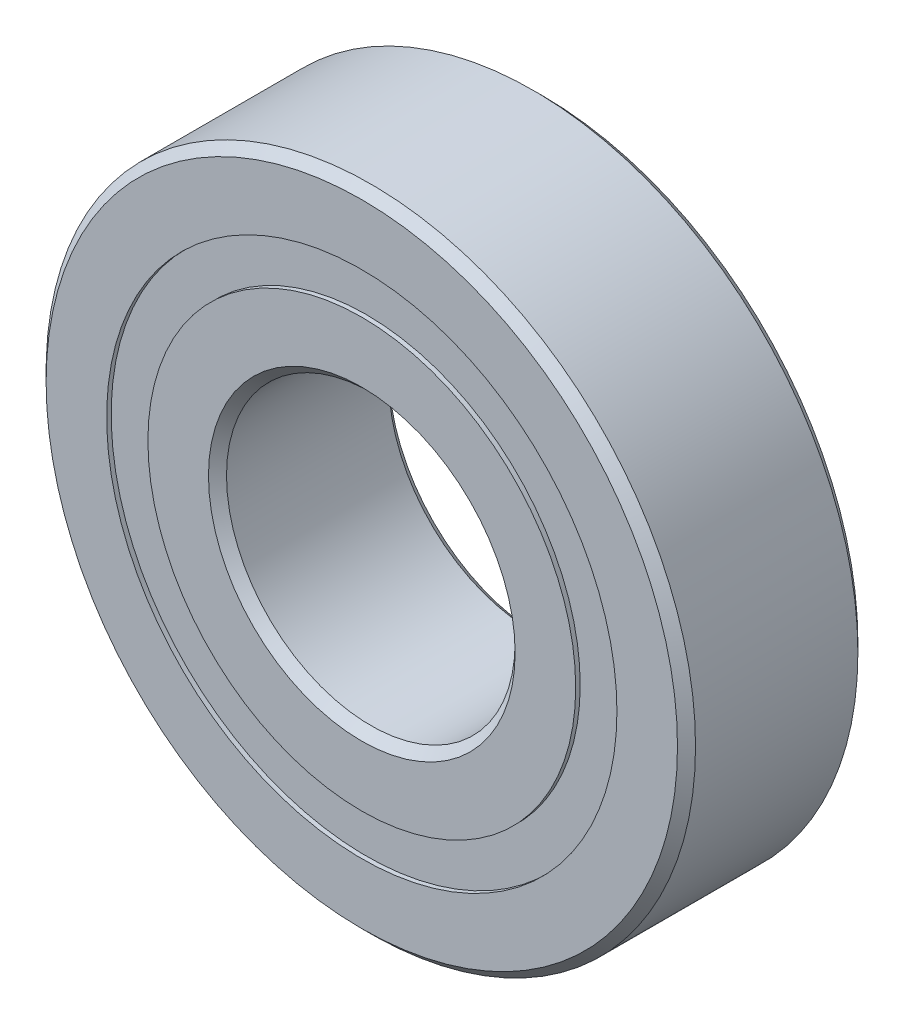
ISO-10303-21;
HEADER;
FILE_DESCRIPTION(('STEP AP214'),'2;1');
FILE_NAME('part.step','',(''),(''),'','','');
FILE_SCHEMA(('AUTOMOTIVE_DESIGN { 1 0 10303 214 1 1 1 1 }'));
ENDSEC;
DATA;
#1=APPLICATION_CONTEXT('core data for automotive mechanical design processes');
#2=APPLICATION_PROTOCOL_DEFINITION('international standard','automotive_design',2000,#1);
#3=PRODUCT_CONTEXT('',#1,'mechanical');
#4=PRODUCT('Part','Part','',(#3));
#5=PRODUCT_RELATED_PRODUCT_CATEGORY('part','',(#4));
#6=PRODUCT_DEFINITION_FORMATION('','',#4);
#7=PRODUCT_DEFINITION_CONTEXT('part definition',#1,'design');
#8=PRODUCT_DEFINITION('design','',#6,#7);
#9=PRODUCT_DEFINITION_SHAPE('','',#8);
#10=(LENGTH_UNIT() NAMED_UNIT(*) SI_UNIT(.MILLI.,.METRE.));
#11=(NAMED_UNIT(*) PLANE_ANGLE_UNIT() SI_UNIT($,.RADIAN.));
#12=(NAMED_UNIT(*) SI_UNIT($,.STERADIAN.) SOLID_ANGLE_UNIT());
#13=UNCERTAINTY_MEASURE_WITH_UNIT(LENGTH_MEASURE(1.E-05),#10,'distance_accuracy_value','');
#14=(GEOMETRIC_REPRESENTATION_CONTEXT(3) GLOBAL_UNCERTAINTY_ASSIGNED_CONTEXT((#13)) GLOBAL_UNIT_ASSIGNED_CONTEXT((#10,
#11,#12)) REPRESENTATION_CONTEXT('',''));
#15=CARTESIAN_POINT('',(0.,0.,0.));
#16=DIRECTION('',(0.,0.,1.));
#17=DIRECTION('',(1.,0.,0.));
#18=AXIS2_PLACEMENT_3D('',#15,#16,#17);
#19=CARTESIAN_POINT('',(0.,11.2258928571429,-3.7703125));
#20=DIRECTION('',(0.,0.,1.));
#21=DIRECTION('',(1.,0.,0.));
#22=AXIS2_PLACEMENT_3D('',#19,#20,#21);
#23=PLANE('',#22);
#24=CARTESIAN_POINT('',(0.,0.,-3.7703125));
#25=DIRECTION('',(0.,0.,1.));
#26=DIRECTION('',(1.,0.,0.));
#27=AXIS2_PLACEMENT_3D('',#24,#25,#26);
#28=CIRCLE('',#27,11.2258928571429);
#29=CARTESIAN_POINT('',(11.2258928571429,0.,-3.7703125));
#30=VERTEX_POINT('',#29);
#31=EDGE_CURVE('E64',#30,#30,#28,.T.);
#32=ORIENTED_EDGE('',*,*,#31,.F.);
#33=EDGE_LOOP('',(#32));
#34=FACE_BOUND('',#33,.T.);
#35=CARTESIAN_POINT('',(0.,0.,-3.7703125));
#36=DIRECTION('',(0.,0.,1.));
#37=DIRECTION('',(1.,0.,0.));
#38=AXIS2_PLACEMENT_3D('',#35,#36,#37);
#39=CIRCLE('',#38,9.41160714285714);
#40=CARTESIAN_POINT('',(9.41160714285714,0.,-3.7703125));
#41=VERTEX_POINT('',#40);
#42=EDGE_CURVE('E11',#41,#41,#39,.T.);
#43=ORIENTED_EDGE('',*,*,#42,.T.);
#44=EDGE_LOOP('',(#43));
#45=FACE_BOUND('',#44,.T.);
#46=ADVANCED_FACE('F47',(#34,#45),#23,.F.);
#47=CARTESIAN_POINT('',(0.,0.,3.96875));
#48=DIRECTION('',(0.,0.,1.));
#49=DIRECTION('',(1.,0.,0.));
#50=AXIS2_PLACEMENT_3D('',#47,#48,#49);
#51=CYLINDRICAL_SURFACE('',#50,9.41160714285714);
#52=ORIENTED_EDGE('',*,*,#42,.F.);
#53=EDGE_LOOP('',(#52));
#54=FACE_BOUND('',#53,.T.);
#55=CARTESIAN_POINT('',(0.,0.,-1.9834848564108));
#56=DIRECTION('',(0.,0.,1.));
#57=DIRECTION('',(1.,0.,0.));
#58=AXIS2_PLACEMENT_3D('',#55,#56,#57);
#59=CIRCLE('',#58,9.41160714285714);
#60=CARTESIAN_POINT('',(9.41160714285714,0.,-1.9834848564108));
#61=VERTEX_POINT('',#60);
#62=EDGE_CURVE('E54',#61,#61,#59,.T.);
#63=ORIENTED_EDGE('',*,*,#62,.T.);
#64=EDGE_LOOP('',(#63));
#65=FACE_BOUND('',#64,.T.);
#66=ADVANCED_FACE('F74',(#54,#65),#51,.F.);
#67=CARTESIAN_POINT('',(0.,11.2258928571429,-1.9834848564108));
#68=DIRECTION('',(0.,0.,-1.));
#69=DIRECTION('',(-1.,0.,0.));
#70=AXIS2_PLACEMENT_3D('',#67,#68,#69);
#71=PLANE('',#70);
#72=ORIENTED_EDGE('',*,*,#62,.F.);
#73=EDGE_LOOP('',(#72));
#74=FACE_BOUND('',#73,.T.);
#75=CARTESIAN_POINT('',(0.,0.,-1.9834848564108));
#76=DIRECTION('',(0.,0.,1.));
#77=DIRECTION('',(1.,0.,0.));
#78=AXIS2_PLACEMENT_3D('',#75,#76,#77);
#79=CIRCLE('',#78,11.2258928571429);
#80=CARTESIAN_POINT('',(11.2258928571429,0.,-1.9834848564108));
#81=VERTEX_POINT('',#80);
#82=EDGE_CURVE('E60',#81,#81,#79,.T.);
#83=ORIENTED_EDGE('',*,*,#82,.T.);
#84=EDGE_LOOP('',(#83));
#85=FACE_BOUND('',#84,.T.);
#86=ADVANCED_FACE('F78',(#74,#85),#71,.F.);
#87=CARTESIAN_POINT('',(0.,0.,3.96875));
#88=DIRECTION('',(0.,0.,1.));
#89=DIRECTION('',(1.,0.,0.));
#90=AXIS2_PLACEMENT_3D('',#87,#88,#89);
#91=CYLINDRICAL_SURFACE('',#90,11.2258928571429);
#92=ORIENTED_EDGE('',*,*,#82,.F.);
#93=EDGE_LOOP('',(#92));
#94=FACE_BOUND('',#93,.T.);
#95=ORIENTED_EDGE('',*,*,#31,.T.);
#96=EDGE_LOOP('',(#95));
#97=FACE_BOUND('',#96,.T.);
#98=ADVANCED_FACE('F71',(#94,#97),#91,.T.);
#99=CLOSED_SHELL('',(#46,#66,#86,#98));
#100=MANIFOLD_SOLID_BREP('B2',#99);
#101=CARTESIAN_POINT('',(0.,11.2258928571429,3.7703125));
#102=DIRECTION('',(0.,0.,-1.));
#103=DIRECTION('',(-1.,0.,0.));
#104=AXIS2_PLACEMENT_3D('',#101,#102,#103);
#105=PLANE('',#104);
#106=CARTESIAN_POINT('',(0.,0.,3.7703125));
#107=DIRECTION('',(0.,0.,1.));
#108=DIRECTION('',(1.,0.,0.));
#109=AXIS2_PLACEMENT_3D('',#106,#107,#108);
#110=CIRCLE('',#109,9.41160714285714);
#111=CARTESIAN_POINT('',(9.41160714285714,0.,3.7703125));
#112=VERTEX_POINT('',#111);
#113=EDGE_CURVE('E46',#112,#112,#110,.T.);
#114=ORIENTED_EDGE('',*,*,#113,.F.);
#115=EDGE_LOOP('',(#114));
#116=FACE_BOUND('',#115,.T.);
#117=CARTESIAN_POINT('',(0.,0.,3.7703125));
#118=DIRECTION('',(0.,0.,1.));
#119=DIRECTION('',(1.,0.,0.));
#120=AXIS2_PLACEMENT_3D('',#117,#118,#119);
#121=CIRCLE('',#120,11.2258928571429);
#122=CARTESIAN_POINT('',(11.2258928571429,0.,3.7703125));
#123=VERTEX_POINT('',#122);
#124=EDGE_CURVE('E140',#123,#123,#121,.T.);
#125=ORIENTED_EDGE('',*,*,#124,.T.);
#126=EDGE_LOOP('',(#125));
#127=FACE_BOUND('',#126,.T.);
#128=ADVANCED_FACE('F122',(#116,#127),#105,.F.);
#129=CARTESIAN_POINT('',(0.,0.,3.96875));
#130=DIRECTION('',(0.,0.,1.));
#131=DIRECTION('',(1.,0.,0.));
#132=AXIS2_PLACEMENT_3D('',#129,#130,#131);
#133=CYLINDRICAL_SURFACE('',#132,9.41160714285714);
#134=CARTESIAN_POINT('',(0.,0.,1.9834848564108));
#135=DIRECTION('',(0.,0.,1.));
#136=DIRECTION('',(1.,0.,0.));
#137=AXIS2_PLACEMENT_3D('',#134,#135,#136);
#138=CIRCLE('',#137,9.41160714285714);
#139=CARTESIAN_POINT('',(9.41160714285714,0.,1.9834848564108));
#140=VERTEX_POINT('',#139);
#141=EDGE_CURVE('E129',#140,#140,#138,.T.);
#142=ORIENTED_EDGE('',*,*,#141,.F.);
#143=EDGE_LOOP('',(#142));
#144=FACE_BOUND('',#143,.T.);
#145=ORIENTED_EDGE('',*,*,#113,.T.);
#146=EDGE_LOOP('',(#145));
#147=FACE_BOUND('',#146,.T.);
#148=ADVANCED_FACE('F155',(#144,#147),#133,.F.);
#149=CARTESIAN_POINT('',(0.,11.2258928571429,1.9834848564108));
#150=DIRECTION('',(0.,0.,1.));
#151=DIRECTION('',(1.,0.,0.));
#152=AXIS2_PLACEMENT_3D('',#149,#150,#151);
#153=PLANE('',#152);
#154=CARTESIAN_POINT('',(0.,0.,1.9834848564108));
#155=DIRECTION('',(0.,0.,1.));
#156=DIRECTION('',(1.,0.,0.));
#157=AXIS2_PLACEMENT_3D('',#154,#155,#156);
#158=CIRCLE('',#157,11.2258928571429);
#159=CARTESIAN_POINT('',(11.2258928571429,0.,1.9834848564108));
#160=VERTEX_POINT('',#159);
#161=EDGE_CURVE('E135',#160,#160,#158,.T.);
#162=ORIENTED_EDGE('',*,*,#161,.F.);
#163=EDGE_LOOP('',(#162));
#164=FACE_BOUND('',#163,.T.);
#165=ORIENTED_EDGE('',*,*,#141,.T.);
#166=EDGE_LOOP('',(#165));
#167=FACE_BOUND('',#166,.T.);
#168=ADVANCED_FACE('F150',(#164,#167),#153,.F.);
#169=CARTESIAN_POINT('',(0.,0.,3.96875));
#170=DIRECTION('',(0.,0.,1.));
#171=DIRECTION('',(1.,0.,0.));
#172=AXIS2_PLACEMENT_3D('',#169,#170,#171);
#173=CYLINDRICAL_SURFACE('',#172,11.2258928571429);
#174=ORIENTED_EDGE('',*,*,#124,.F.);
#175=EDGE_LOOP('',(#174));
#176=FACE_BOUND('',#175,.T.);
#177=ORIENTED_EDGE('',*,*,#161,.T.);
#178=EDGE_LOOP('',(#177));
#179=FACE_BOUND('',#178,.T.);
#180=ADVANCED_FACE('F147',(#176,#179),#173,.T.);
#181=CLOSED_SHELL('',(#128,#148,#168,#180));
#182=MANIFOLD_SOLID_BREP('B6',#181);
#183=CARTESIAN_POINT('',(-6.06520907209285,8.34804411070657,0.));
#184=DIRECTION('',(0.,0.,1.));
#185=DIRECTION('',(-0.587785252292462,0.809016994374955,0.));
#186=AXIS2_PLACEMENT_3D('',#183,#184,#185);
#187=SPHERICAL_SURFACE('',#186,1.9834848564108);
#188=CARTESIAN_POINT('',(-6.06520907209285,8.34804411070657,1.9834848564108));
#189=VERTEX_POINT('',#188);
#190=VERTEX_LOOP('',#189);
#191=FACE_BOUND('',#190,.T.);
#192=ADVANCED_FACE('F196',(#191),#187,.T.);
#193=CLOSED_SHELL('',(#192));
#194=MANIFOLD_SOLID_BREP('B41',#193);
#195=CARTESIAN_POINT('',(-9.81371442752058,3.1886691107066,0.));
#196=DIRECTION('',(0.,0.,1.));
#197=DIRECTION('',(-0.95105651629515,0.309016994374958,0.));
#198=AXIS2_PLACEMENT_3D('',#195,#196,#197);
#199=SPHERICAL_SURFACE('',#198,1.9834848564108);
#200=CARTESIAN_POINT('',(-9.81371442752058,3.1886691107066,1.9834848564108));
#201=VERTEX_POINT('',#200);
#202=VERTEX_LOOP('',#201);
#203=FACE_BOUND('',#202,.T.);
#204=ADVANCED_FACE('F216',(#203),#199,.T.);
#205=CLOSED_SHELL('',(#204));
#206=MANIFOLD_SOLID_BREP('B118',#205);
#207=CARTESIAN_POINT('',(-9.81371442752065,-3.18866911070639,0.));
#208=DIRECTION('',(0.,0.,1.));
#209=DIRECTION('',(-0.951056516295157,-0.309016994374938,0.));
#210=AXIS2_PLACEMENT_3D('',#207,#208,#209);
#211=SPHERICAL_SURFACE('',#210,1.9834848564108);
#212=CARTESIAN_POINT('',(-9.81371442752065,-3.18866911070639,1.9834848564108));
#213=VERTEX_POINT('',#212);
#214=VERTEX_LOOP('',#213);
#215=FACE_BOUND('',#214,.T.);
#216=ADVANCED_FACE('F237',(#215),#211,.T.);
#217=CLOSED_SHELL('',(#216));
#218=MANIFOLD_SOLID_BREP('B192',#217);
#219=CARTESIAN_POINT('',(-6.06520907209303,-8.34804411070643,0.));
#220=DIRECTION('',(0.,0.,1.));
#221=DIRECTION('',(-0.58778525229248,-0.809016994374942,0.));
#222=AXIS2_PLACEMENT_3D('',#219,#220,#221);
#223=SPHERICAL_SURFACE('',#222,1.9834848564108);
#224=CARTESIAN_POINT('',(-6.06520907209303,-8.34804411070643,1.9834848564108));
#225=VERTEX_POINT('',#224);
#226=VERTEX_LOOP('',#225);
#227=FACE_BOUND('',#226,.T.);
#228=ADVANCED_FACE('F257',(#227),#223,.T.);
#229=CLOSED_SHELL('',(#228));
#230=MANIFOLD_SOLID_BREP('B212',#229);
#231=CARTESIAN_POINT('',(0.,-10.31875,0.));
#232=DIRECTION('',(0.,0.,1.));
#233=DIRECTION('',(0.,-1.,0.));
#234=AXIS2_PLACEMENT_3D('',#231,#232,#233);
#235=SPHERICAL_SURFACE('',#234,1.9834848564108);
#236=CARTESIAN_POINT('',(0.,-10.31875,1.9834848564108));
#237=VERTEX_POINT('',#236);
#238=VERTEX_LOOP('',#237);
#239=FACE_BOUND('',#238,.T.);
#240=ADVANCED_FACE('F277',(#239),#235,.T.);
#241=CLOSED_SHELL('',(#240));
#242=MANIFOLD_SOLID_BREP('B233',#241);
#243=CARTESIAN_POINT('',(6.06520907209291,-8.34804411070652,0.));
#244=DIRECTION('',(0.,0.,1.));
#245=DIRECTION('',(0.587785252292469,-0.809016994374951,0.));
#246=AXIS2_PLACEMENT_3D('',#243,#244,#245);
#247=SPHERICAL_SURFACE('',#246,1.9834848564108);
#248=CARTESIAN_POINT('',(6.06520907209291,-8.34804411070652,1.9834848564108));
#249=VERTEX_POINT('',#248);
#250=VERTEX_LOOP('',#249);
#251=FACE_BOUND('',#250,.T.);
#252=ADVANCED_FACE('F297',(#251),#247,.T.);
#253=CLOSED_SHELL('',(#252));
#254=MANIFOLD_SOLID_BREP('B253',#253);
#255=CARTESIAN_POINT('',(9.8137144275206,-3.18866911070653,0.));
#256=DIRECTION('',(0.,0.,1.));
#257=DIRECTION('',(0.951056516295152,-0.309016994374952,0.));
#258=AXIS2_PLACEMENT_3D('',#255,#256,#257);
#259=SPHERICAL_SURFACE('',#258,1.9834848564108);
#260=CARTESIAN_POINT('',(9.8137144275206,-3.18866911070653,1.9834848564108));
#261=VERTEX_POINT('',#260);
#262=VERTEX_LOOP('',#261);
#263=FACE_BOUND('',#262,.T.);
#264=ADVANCED_FACE('F317',(#263),#259,.T.);
#265=CLOSED_SHELL('',(#264));
#266=MANIFOLD_SOLID_BREP('B273',#265);
#267=CARTESIAN_POINT('',(9.81371442752063,3.18866911070646,0.));
#268=DIRECTION('',(0.,0.,1.));
#269=DIRECTION('',(0.951056516295155,0.309016994374945,0.));
#270=AXIS2_PLACEMENT_3D('',#267,#268,#269);
#271=SPHERICAL_SURFACE('',#270,1.9834848564108);
#272=CARTESIAN_POINT('',(9.81371442752063,3.18866911070646,1.9834848564108));
#273=VERTEX_POINT('',#272);
#274=VERTEX_LOOP('',#273);
#275=FACE_BOUND('',#274,.T.);
#276=ADVANCED_FACE('F337',(#275),#271,.T.);
#277=CLOSED_SHELL('',(#276));
#278=MANIFOLD_SOLID_BREP('B293',#277);
#279=CARTESIAN_POINT('',(6.06520907209297,8.34804411070648,0.));
#280=DIRECTION('',(0.,0.,1.));
#281=DIRECTION('',(0.587785252292474,0.809016994374947,0.));
#282=AXIS2_PLACEMENT_3D('',#279,#280,#281);
#283=SPHERICAL_SURFACE('',#282,1.9834848564108);
#284=CARTESIAN_POINT('',(6.06520907209297,8.34804411070648,1.9834848564108));
#285=VERTEX_POINT('',#284);
#286=VERTEX_LOOP('',#285);
#287=FACE_BOUND('',#286,.T.);
#288=ADVANCED_FACE('F357',(#287),#283,.T.);
#289=CLOSED_SHELL('',(#288));
#290=MANIFOLD_SOLID_BREP('B313',#289);
#291=CARTESIAN_POINT('',(0.,10.31875,0.));
#292=DIRECTION('',(0.,0.,1.));
#293=DIRECTION('',(0.,1.,0.));
#294=AXIS2_PLACEMENT_3D('',#291,#292,#293);
#295=SPHERICAL_SURFACE('',#294,1.9834848564108);
#296=CARTESIAN_POINT('',(0.,10.31875,1.9834848564108));
#297=VERTEX_POINT('',#296);
#298=VERTEX_LOOP('',#297);
#299=FACE_BOUND('',#298,.T.);
#300=ADVANCED_FACE('F380',(#299),#295,.T.);
#301=CLOSED_SHELL('',(#300));
#302=MANIFOLD_SOLID_BREP('B333',#301);
#303=CARTESIAN_POINT('',(0.,9.41160714285714,3.96875));
#304=DIRECTION('',(0.,0.,-1.));
#305=DIRECTION('',(-1.,0.,0.));
#306=AXIS2_PLACEMENT_3D('',#303,#304,#305);
#307=PLANE('',#306);
#308=CARTESIAN_POINT('',(0.,0.,3.96875));
#309=DIRECTION('',(0.,0.,1.));
#310=DIRECTION('',(1.,0.,0.));
#311=AXIS2_PLACEMENT_3D('',#308,#309,#310);
#312=CIRCLE('',#311,6.746875);
#313=CARTESIAN_POINT('',(6.746875,0.,3.96875));
#314=VERTEX_POINT('',#313);
#315=EDGE_CURVE('E435',#314,#314,#312,.T.);
#316=ORIENTED_EDGE('',*,*,#315,.F.);
#317=EDGE_LOOP('',(#316));
#318=FACE_BOUND('',#317,.T.);
#319=CARTESIAN_POINT('',(0.,0.,3.96875));
#320=DIRECTION('',(0.,0.,1.));
#321=DIRECTION('',(1.,0.,0.));
#322=AXIS2_PLACEMENT_3D('',#319,#320,#321);
#323=CIRCLE('',#322,9.41160714285714);
#324=CARTESIAN_POINT('',(9.41160714285714,0.,3.96875));
#325=VERTEX_POINT('',#324);
#326=EDGE_CURVE('E379',#325,#325,#323,.T.);
#327=ORIENTED_EDGE('',*,*,#326,.T.);
#328=EDGE_LOOP('',(#327));
#329=FACE_BOUND('',#328,.T.);
#330=ADVANCED_FACE('F399',(#318,#329),#307,.F.);
#331=CARTESIAN_POINT('',(0.,0.,3.96875));
#332=DIRECTION('',(0.,0.,1.));
#333=DIRECTION('',(1.,0.,0.));
#334=AXIS2_PLACEMENT_3D('',#331,#332,#333);
#335=CYLINDRICAL_SURFACE('',#334,9.41160714285714);
#336=ORIENTED_EDGE('',*,*,#326,.F.);
#337=EDGE_LOOP('',(#336));
#338=FACE_BOUND('',#337,.T.);
#339=CARTESIAN_POINT('',(0.,0.,1.76388888888889));
#340=DIRECTION('',(0.,0.,1.));
#341=DIRECTION('',(1.,0.,0.));
#342=AXIS2_PLACEMENT_3D('',#339,#340,#341);
#343=CIRCLE('',#342,9.41160714285714);
#344=CARTESIAN_POINT('',(9.41160714285714,0.,1.76388888888889));
#345=VERTEX_POINT('',#344);
#346=EDGE_CURVE('E406',#345,#345,#343,.T.);
#347=ORIENTED_EDGE('',*,*,#346,.T.);
#348=EDGE_LOOP('',(#347));
#349=FACE_BOUND('',#348,.T.);
#350=ADVANCED_FACE('F442',(#338,#349),#335,.T.);
#351=CARTESIAN_POINT('',(0.,0.,0.));
#352=DIRECTION('',(0.,0.,1.));
#353=DIRECTION('',(1.,0.,0.));
#354=AXIS2_PLACEMENT_3D('',#351,#352,#353);
#355=TOROIDAL_SURFACE('',#354,10.31875,1.9834848564108);
#356=ORIENTED_EDGE('',*,*,#346,.F.);
#357=EDGE_LOOP('',(#356));
#358=FACE_BOUND('',#357,.T.);
#359=CARTESIAN_POINT('',(0.,0.,-1.76388888888889));
#360=DIRECTION('',(0.,0.,1.));
#361=DIRECTION('',(1.,0.,0.));
#362=AXIS2_PLACEMENT_3D('',#359,#360,#361);
#363=CIRCLE('',#362,9.41160714285714);
#364=CARTESIAN_POINT('',(9.41160714285714,0.,-1.76388888888889));
#365=VERTEX_POINT('',#364);
#366=EDGE_CURVE('E413',#365,#365,#363,.T.);
#367=ORIENTED_EDGE('',*,*,#366,.T.);
#368=EDGE_LOOP('',(#367));
#369=FACE_BOUND('',#368,.T.);
#370=ADVANCED_FACE('F446',(#358,#369),#355,.F.);
#371=CARTESIAN_POINT('',(0.,0.,3.96875));
#372=DIRECTION('',(0.,0.,1.));
#373=DIRECTION('',(1.,0.,0.));
#374=AXIS2_PLACEMENT_3D('',#371,#372,#373);
#375=CYLINDRICAL_SURFACE('',#374,9.41160714285714);
#376=ORIENTED_EDGE('',*,*,#366,.F.);
#377=EDGE_LOOP('',(#376));
#378=FACE_BOUND('',#377,.T.);
#379=CARTESIAN_POINT('',(0.,0.,-3.96875));
#380=DIRECTION('',(0.,0.,1.));
#381=DIRECTION('',(1.,0.,0.));
#382=AXIS2_PLACEMENT_3D('',#379,#380,#381);
#383=CIRCLE('',#382,9.41160714285714);
#384=CARTESIAN_POINT('',(9.41160714285714,0.,-3.96875));
#385=VERTEX_POINT('',#384);
#386=EDGE_CURVE('E419',#385,#385,#383,.T.);
#387=ORIENTED_EDGE('',*,*,#386,.T.);
#388=EDGE_LOOP('',(#387));
#389=FACE_BOUND('',#388,.T.);
#390=ADVANCED_FACE('F451',(#378,#389),#375,.T.);
#391=CARTESIAN_POINT('',(0.,6.746875,-3.96875));
#392=DIRECTION('',(0.,0.,1.));
#393=DIRECTION('',(1.,0.,0.));
#394=AXIS2_PLACEMENT_3D('',#391,#392,#393);
#395=PLANE('',#394);
#396=ORIENTED_EDGE('',*,*,#386,.F.);
#397=EDGE_LOOP('',(#396));
#398=FACE_BOUND('',#397,.T.);
#399=CARTESIAN_POINT('',(0.,0.,-3.96875));
#400=DIRECTION('',(0.,0.,1.));
#401=DIRECTION('',(1.,0.,0.));
#402=AXIS2_PLACEMENT_3D('',#399,#400,#401);
#403=CIRCLE('',#402,6.746875);
#404=CARTESIAN_POINT('',(6.746875,0.,-3.96875));
#405=VERTEX_POINT('',#404);
#406=EDGE_CURVE('E424',#405,#405,#403,.T.);
#407=ORIENTED_EDGE('',*,*,#406,.T.);
#408=EDGE_LOOP('',(#407));
#409=FACE_BOUND('',#408,.T.);
#410=ADVANCED_FACE('F457',(#398,#409),#395,.F.);
#411=CARTESIAN_POINT('',(0.,0.,-3.571875));
#412=DIRECTION('',(0.,0.,-1.));
#413=DIRECTION('',(-1.,0.,0.));
#414=AXIS2_PLACEMENT_3D('',#411,#412,#413);
#415=CONICAL_SURFACE('',#414,6.35,0.785398163397446);
#416=ORIENTED_EDGE('',*,*,#406,.F.);
#417=EDGE_LOOP('',(#416));
#418=FACE_BOUND('',#417,.T.);
#419=CARTESIAN_POINT('',(0.,0.,-3.571875));
#420=DIRECTION('',(0.,0.,1.));
#421=DIRECTION('',(1.,0.,0.));
#422=AXIS2_PLACEMENT_3D('',#419,#420,#421);
#423=CIRCLE('',#422,6.35);
#424=CARTESIAN_POINT('',(6.35,0.,-3.571875));
#425=VERTEX_POINT('',#424);
#426=EDGE_CURVE('E428',#425,#425,#423,.T.);
#427=ORIENTED_EDGE('',*,*,#426,.T.);
#428=EDGE_LOOP('',(#427));
#429=FACE_BOUND('',#428,.T.);
#430=ADVANCED_FACE('F461',(#418,#429),#415,.F.);
#431=CARTESIAN_POINT('',(0.,0.,3.96875));
#432=DIRECTION('',(0.,0.,1.));
#433=DIRECTION('',(1.,0.,0.));
#434=AXIS2_PLACEMENT_3D('',#431,#432,#433);
#435=CYLINDRICAL_SURFACE('',#434,6.35);
#436=ORIENTED_EDGE('',*,*,#426,.F.);
#437=EDGE_LOOP('',(#436));
#438=FACE_BOUND('',#437,.T.);
#439=CARTESIAN_POINT('',(0.,0.,3.571875));
#440=DIRECTION('',(0.,0.,1.));
#441=DIRECTION('',(1.,0.,0.));
#442=AXIS2_PLACEMENT_3D('',#439,#440,#441);
#443=CIRCLE('',#442,6.35);
#444=CARTESIAN_POINT('',(6.35,0.,3.571875));
#445=VERTEX_POINT('',#444);
#446=EDGE_CURVE('E431',#445,#445,#443,.T.);
#447=ORIENTED_EDGE('',*,*,#446,.T.);
#448=EDGE_LOOP('',(#447));
#449=FACE_BOUND('',#448,.T.);
#450=ADVANCED_FACE('F465',(#438,#449),#435,.F.);
#451=CARTESIAN_POINT('',(0.,0.,3.96875));
#452=DIRECTION('',(0.,0.,1.));
#453=DIRECTION('',(1.,0.,0.));
#454=AXIS2_PLACEMENT_3D('',#451,#452,#453);
#455=CONICAL_SURFACE('',#454,6.746875,0.78539816339745);
#456=ORIENTED_EDGE('',*,*,#446,.F.);
#457=EDGE_LOOP('',(#456));
#458=FACE_BOUND('',#457,.T.);
#459=ORIENTED_EDGE('',*,*,#315,.T.);
#460=EDGE_LOOP('',(#459));
#461=FACE_BOUND('',#460,.T.);
#462=ADVANCED_FACE('F439',(#458,#461),#455,.F.);
#463=CLOSED_SHELL('',(#330,#350,#370,#390,#410,#430,#450,#462));
#464=MANIFOLD_SOLID_BREP('B353',#463);
#465=CARTESIAN_POINT('',(0.,0.,3.571875));
#466=DIRECTION('',(0.,0.,-1.));
#467=DIRECTION('',(-1.,0.,0.));
#468=AXIS2_PLACEMENT_3D('',#465,#466,#467);
#469=CONICAL_SURFACE('',#468,14.2875,0.785398163397448);
#470=CARTESIAN_POINT('',(0.,0.,3.96875));
#471=DIRECTION('',(0.,0.,1.));
#472=DIRECTION('',(1.,0.,0.));
#473=AXIS2_PLACEMENT_3D('',#470,#471,#472);
#474=CIRCLE('',#473,13.890625);
#475=CARTESIAN_POINT('',(13.890625,0.,3.96875));
#476=VERTEX_POINT('',#475);
#477=EDGE_CURVE('E570',#476,#476,#474,.T.);
#478=ORIENTED_EDGE('',*,*,#477,.F.);
#479=EDGE_LOOP('',(#478));
#480=FACE_BOUND('',#479,.T.);
#481=CARTESIAN_POINT('',(0.,0.,3.571875));
#482=DIRECTION('',(0.,0.,1.));
#483=DIRECTION('',(1.,0.,0.));
#484=AXIS2_PLACEMENT_3D('',#481,#482,#483);
#485=CIRCLE('',#484,14.2875);
#486=CARTESIAN_POINT('',(14.2875,0.,3.571875));
#487=VERTEX_POINT('',#486);
#488=EDGE_CURVE('E398',#487,#487,#485,.T.);
#489=ORIENTED_EDGE('',*,*,#488,.T.);
#490=EDGE_LOOP('',(#489));
#491=FACE_BOUND('',#490,.T.);
#492=ADVANCED_FACE('F534',(#480,#491),#469,.T.);
#493=CARTESIAN_POINT('',(0.,0.,3.96875));
#494=DIRECTION('',(0.,0.,1.));
#495=DIRECTION('',(1.,0.,0.));
#496=AXIS2_PLACEMENT_3D('',#493,#494,#495);
#497=CYLINDRICAL_SURFACE('',#496,14.2875);
#498=ORIENTED_EDGE('',*,*,#488,.F.);
#499=EDGE_LOOP('',(#498));
#500=FACE_BOUND('',#499,.T.);
#501=CARTESIAN_POINT('',(0.,0.,-3.571875));
#502=DIRECTION('',(0.,0.,1.));
#503=DIRECTION('',(1.,0.,0.));
#504=AXIS2_PLACEMENT_3D('',#501,#502,#503);
#505=CIRCLE('',#504,14.2875);
#506=CARTESIAN_POINT('',(14.2875,0.,-3.571875));
#507=VERTEX_POINT('',#506);
#508=EDGE_CURVE('E541',#507,#507,#505,.T.);
#509=ORIENTED_EDGE('',*,*,#508,.T.);
#510=EDGE_LOOP('',(#509));
#511=FACE_BOUND('',#510,.T.);
#512=ADVANCED_FACE('F577',(#500,#511),#497,.T.);
#513=CARTESIAN_POINT('',(0.,0.,-3.96875));
#514=DIRECTION('',(0.,0.,1.));
#515=DIRECTION('',(1.,0.,0.));
#516=AXIS2_PLACEMENT_3D('',#513,#514,#515);
#517=CONICAL_SURFACE('',#516,13.890625,0.785398163397446);
#518=ORIENTED_EDGE('',*,*,#508,.F.);
#519=EDGE_LOOP('',(#518));
#520=FACE_BOUND('',#519,.T.);
#521=CARTESIAN_POINT('',(0.,0.,-3.96875));
#522=DIRECTION('',(0.,0.,1.));
#523=DIRECTION('',(1.,0.,0.));
#524=AXIS2_PLACEMENT_3D('',#521,#522,#523);
#525=CIRCLE('',#524,13.890625);
#526=CARTESIAN_POINT('',(13.890625,0.,-3.96875));
#527=VERTEX_POINT('',#526);
#528=EDGE_CURVE('E547',#527,#527,#525,.T.);
#529=ORIENTED_EDGE('',*,*,#528,.T.);
#530=EDGE_LOOP('',(#529));
#531=FACE_BOUND('',#530,.T.);
#532=ADVANCED_FACE('F581',(#520,#531),#517,.T.);
#533=CARTESIAN_POINT('',(0.,13.890625,-3.96875));
#534=DIRECTION('',(0.,0.,1.));
#535=DIRECTION('',(1.,0.,0.));
#536=AXIS2_PLACEMENT_3D('',#533,#534,#535);
#537=PLANE('',#536);
#538=ORIENTED_EDGE('',*,*,#528,.F.);
#539=EDGE_LOOP('',(#538));
#540=FACE_BOUND('',#539,.T.);
#541=CARTESIAN_POINT('',(0.,0.,-3.96875));
#542=DIRECTION('',(0.,0.,1.));
#543=DIRECTION('',(1.,0.,0.));
#544=AXIS2_PLACEMENT_3D('',#541,#542,#543);
#545=CIRCLE('',#544,11.2258928571429);
#546=CARTESIAN_POINT('',(11.2258928571429,0.,-3.96875));
#547=VERTEX_POINT('',#546);
#548=EDGE_CURVE('E553',#547,#547,#545,.T.);
#549=ORIENTED_EDGE('',*,*,#548,.T.);
#550=EDGE_LOOP('',(#549));
#551=FACE_BOUND('',#550,.T.);
#552=ADVANCED_FACE('F586',(#540,#551),#537,.F.);
#553=CARTESIAN_POINT('',(0.,0.,3.96875));
#554=DIRECTION('',(0.,0.,1.));
#555=DIRECTION('',(1.,0.,0.));
#556=AXIS2_PLACEMENT_3D('',#553,#554,#555);
#557=CYLINDRICAL_SURFACE('',#556,11.2258928571429);
#558=ORIENTED_EDGE('',*,*,#548,.F.);
#559=EDGE_LOOP('',(#558));
#560=FACE_BOUND('',#559,.T.);
#561=CARTESIAN_POINT('',(0.,0.,-1.76388888888889));
#562=DIRECTION('',(0.,0.,1.));
#563=DIRECTION('',(1.,0.,0.));
#564=AXIS2_PLACEMENT_3D('',#561,#562,#563);
#565=CIRCLE('',#564,11.2258928571429);
#566=CARTESIAN_POINT('',(11.2258928571429,0.,-1.76388888888889));
#567=VERTEX_POINT('',#566);
#568=EDGE_CURVE('E559',#567,#567,#565,.T.);
#569=ORIENTED_EDGE('',*,*,#568,.T.);
#570=EDGE_LOOP('',(#569));
#571=FACE_BOUND('',#570,.T.);
#572=ADVANCED_FACE('F592',(#560,#571),#557,.F.);
#573=CARTESIAN_POINT('',(0.,0.,0.));
#574=DIRECTION('',(0.,0.,1.));
#575=DIRECTION('',(1.,0.,0.));
#576=AXIS2_PLACEMENT_3D('',#573,#574,#575);
#577=TOROIDAL_SURFACE('',#576,10.31875,1.9834848564108);
#578=ORIENTED_EDGE('',*,*,#568,.F.);
#579=EDGE_LOOP('',(#578));
#580=FACE_BOUND('',#579,.T.);
#581=CARTESIAN_POINT('',(0.,0.,1.76388888888889));
#582=DIRECTION('',(0.,0.,1.));
#583=DIRECTION('',(1.,0.,0.));
#584=AXIS2_PLACEMENT_3D('',#581,#582,#583);
#585=CIRCLE('',#584,11.2258928571429);
#586=CARTESIAN_POINT('',(11.2258928571429,0.,1.76388888888889));
#587=VERTEX_POINT('',#586);
#588=EDGE_CURVE('E563',#587,#587,#585,.T.);
#589=ORIENTED_EDGE('',*,*,#588,.T.);
#590=EDGE_LOOP('',(#589));
#591=FACE_BOUND('',#590,.T.);
#592=ADVANCED_FACE('F596',(#580,#591),#577,.F.);
#593=CARTESIAN_POINT('',(0.,0.,3.96875));
#594=DIRECTION('',(0.,0.,1.));
#595=DIRECTION('',(1.,0.,0.));
#596=AXIS2_PLACEMENT_3D('',#593,#594,#595);
#597=CYLINDRICAL_SURFACE('',#596,11.2258928571429);
#598=ORIENTED_EDGE('',*,*,#588,.F.);
#599=EDGE_LOOP('',(#598));
#600=FACE_BOUND('',#599,.T.);
#601=CARTESIAN_POINT('',(0.,0.,3.96875));
#602=DIRECTION('',(0.,0.,1.));
#603=DIRECTION('',(1.,0.,0.));
#604=AXIS2_PLACEMENT_3D('',#601,#602,#603);
#605=CIRCLE('',#604,11.2258928571429);
#606=CARTESIAN_POINT('',(11.2258928571429,0.,3.96875));
#607=VERTEX_POINT('',#606);
#608=EDGE_CURVE('E567',#607,#607,#605,.T.);
#609=ORIENTED_EDGE('',*,*,#608,.T.);
#610=EDGE_LOOP('',(#609));
#611=FACE_BOUND('',#610,.T.);
#612=ADVANCED_FACE('F600',(#600,#611),#597,.F.);
#613=CARTESIAN_POINT('',(0.,13.890625,3.96875));
#614=DIRECTION('',(0.,0.,-1.));
#615=DIRECTION('',(-1.,0.,0.));
#616=AXIS2_PLACEMENT_3D('',#613,#614,#615);
#617=PLANE('',#616);
#618=ORIENTED_EDGE('',*,*,#608,.F.);
#619=EDGE_LOOP('',(#618));
#620=FACE_BOUND('',#619,.T.);
#621=ORIENTED_EDGE('',*,*,#477,.T.);
#622=EDGE_LOOP('',(#621));
#623=FACE_BOUND('',#622,.T.);
#624=ADVANCED_FACE('F574',(#620,#623),#617,.F.);
#625=CLOSED_SHELL('',(#492,#512,#532,#552,#572,#592,#612,#624));
#626=MANIFOLD_SOLID_BREP('B374',#625);
#627=ADVANCED_BREP_SHAPE_REPRESENTATION('',(#18,#100,#182,#194,#206,#218,#230,#242,#254,#266,
#278,#290,#302,#464,#626),#14);
#628=SHAPE_DEFINITION_REPRESENTATION(#9,#627);
ENDSEC;
END-ISO-10303-21;
